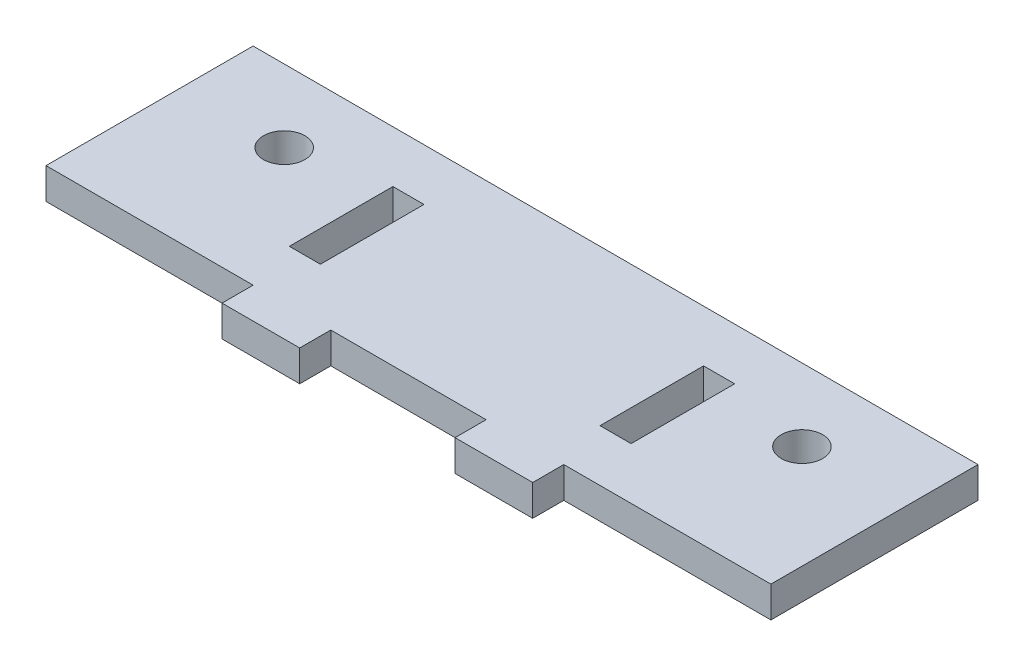
ISO-10303-21;
HEADER;
FILE_DESCRIPTION(('STEP AP214'),'2;1');
FILE_NAME('part.step','',(''),(''),'','','');
FILE_SCHEMA(('AUTOMOTIVE_DESIGN { 1 0 10303 214 1 1 1 1 }'));
ENDSEC;
DATA;
#1=APPLICATION_CONTEXT('core data for automotive mechanical design processes');
#2=APPLICATION_PROTOCOL_DEFINITION('international standard','automotive_design',2000,#1);
#3=PRODUCT_CONTEXT('',#1,'mechanical');
#4=PRODUCT('Part','Part','',(#3));
#5=PRODUCT_RELATED_PRODUCT_CATEGORY('part','',(#4));
#6=PRODUCT_DEFINITION_FORMATION('','',#4);
#7=PRODUCT_DEFINITION_CONTEXT('part definition',#1,'design');
#8=PRODUCT_DEFINITION('design','',#6,#7);
#9=PRODUCT_DEFINITION_SHAPE('','',#8);
#10=(LENGTH_UNIT() NAMED_UNIT(*) SI_UNIT(.MILLI.,.METRE.));
#11=(NAMED_UNIT(*) PLANE_ANGLE_UNIT() SI_UNIT($,.RADIAN.));
#12=(NAMED_UNIT(*) SI_UNIT($,.STERADIAN.) SOLID_ANGLE_UNIT());
#13=UNCERTAINTY_MEASURE_WITH_UNIT(LENGTH_MEASURE(1.E-05),#10,'distance_accuracy_value','');
#14=(GEOMETRIC_REPRESENTATION_CONTEXT(3) GLOBAL_UNCERTAINTY_ASSIGNED_CONTEXT((#13)) GLOBAL_UNIT_ASSIGNED_CONTEXT((#10,
#11,#12)) REPRESENTATION_CONTEXT('',''));
#15=CARTESIAN_POINT('',(0.,0.,0.));
#16=DIRECTION('',(0.,0.,1.));
#17=DIRECTION('',(1.,0.,0.));
#18=AXIS2_PLACEMENT_3D('',#15,#16,#17);
#19=CARTESIAN_POINT('',(0.,3.,0.));
#20=DIRECTION('',(0.,-1.,0.));
#21=DIRECTION('',(0.,0.,-1.));
#22=AXIS2_PLACEMENT_3D('',#19,#20,#21);
#23=PLANE('',#22);
#24=DIRECTION('',(0.,0.,1.));
#25=VECTOR('',#24,1.);
#26=CARTESIAN_POINT('',(18.5,3.,-15.));
#27=LINE('',#26,#25);
#28=CARTESIAN_POINT('',(18.5,3.,-15.));
#29=VERTEX_POINT('',#28);
#30=CARTESIAN_POINT('',(18.5,3.,-5.));
#31=VERTEX_POINT('',#30);
#32=EDGE_CURVE('E234',#29,#31,#27,.T.);
#33=ORIENTED_EDGE('',*,*,#32,.F.);
#34=DIRECTION('',(-1.,0.,0.));
#35=VECTOR('',#34,1.);
#36=CARTESIAN_POINT('',(18.5,3.,-15.));
#37=LINE('',#36,#35);
#38=CARTESIAN_POINT('',(21.5,3.,-15.));
#39=VERTEX_POINT('',#38);
#40=EDGE_CURVE('E245',#39,#29,#37,.T.);
#41=ORIENTED_EDGE('',*,*,#40,.F.);
#42=DIRECTION('',(0.,0.,-1.));
#43=VECTOR('',#42,1.);
#44=CARTESIAN_POINT('',(21.5,3.,-15.));
#45=LINE('',#44,#43);
#46=CARTESIAN_POINT('',(21.5,3.,-5.));
#47=VERTEX_POINT('',#46);
#48=EDGE_CURVE('E241',#47,#39,#45,.T.);
#49=ORIENTED_EDGE('',*,*,#48,.F.);
#50=DIRECTION('',(1.,0.,0.));
#51=VECTOR('',#50,1.);
#52=CARTESIAN_POINT('',(18.5,3.,-5.));
#53=LINE('',#52,#51);
#54=EDGE_CURVE('E237',#31,#47,#53,.T.);
#55=ORIENTED_EDGE('',*,*,#54,.F.);
#56=EDGE_LOOP('',(#33,#41,#49,#55));
#57=FACE_BOUND('',#56,.T.);
#58=DIRECTION('',(0.,0.,1.));
#59=VECTOR('',#58,1.);
#60=CARTESIAN_POINT('',(0.,3.,0.));
#61=LINE('',#60,#59);
#62=CARTESIAN_POINT('',(0.,3.,-20.));
#63=VERTEX_POINT('',#62);
#64=CARTESIAN_POINT('',(0.,3.,0.));
#65=VERTEX_POINT('',#64);
#66=EDGE_CURVE('E277',#63,#65,#61,.T.);
#67=ORIENTED_EDGE('',*,*,#66,.T.);
#68=DIRECTION('',(1.,0.,0.));
#69=VECTOR('',#68,1.);
#70=CARTESIAN_POINT('',(0.,3.,0.));
#71=LINE('',#70,#69);
#72=CARTESIAN_POINT('',(20.,3.,0.));
#73=VERTEX_POINT('',#72);
#74=EDGE_CURVE('E281',#65,#73,#71,.T.);
#75=ORIENTED_EDGE('',*,*,#74,.T.);
#76=DIRECTION('',(0.,0.,1.));
#77=VECTOR('',#76,1.);
#78=CARTESIAN_POINT('',(20.,3.,0.));
#79=LINE('',#78,#77);
#80=CARTESIAN_POINT('',(20.,3.,3.));
#81=VERTEX_POINT('',#80);
#82=EDGE_CURVE('E285',#73,#81,#79,.T.);
#83=ORIENTED_EDGE('',*,*,#82,.T.);
#84=DIRECTION('',(1.,0.,0.));
#85=VECTOR('',#84,1.);
#86=CARTESIAN_POINT('',(20.,3.,3.));
#87=LINE('',#86,#85);
#88=CARTESIAN_POINT('',(27.5,3.,3.));
#89=VERTEX_POINT('',#88);
#90=EDGE_CURVE('E288',#81,#89,#87,.T.);
#91=ORIENTED_EDGE('',*,*,#90,.T.);
#92=DIRECTION('',(0.,0.,-1.));
#93=VECTOR('',#92,1.);
#94=CARTESIAN_POINT('',(27.5,3.,0.));
#95=LINE('',#94,#93);
#96=CARTESIAN_POINT('',(27.5,3.,0.));
#97=VERTEX_POINT('',#96);
#98=EDGE_CURVE('E291',#89,#97,#95,.T.);
#99=ORIENTED_EDGE('',*,*,#98,.T.);
#100=DIRECTION('',(1.,0.,0.));
#101=VECTOR('',#100,1.);
#102=CARTESIAN_POINT('',(27.5,3.,0.));
#103=LINE('',#102,#101);
#104=CARTESIAN_POINT('',(42.5,3.,0.));
#105=VERTEX_POINT('',#104);
#106=EDGE_CURVE('E294',#97,#105,#103,.T.);
#107=ORIENTED_EDGE('',*,*,#106,.T.);
#108=DIRECTION('',(0.,0.,1.));
#109=VECTOR('',#108,1.);
#110=CARTESIAN_POINT('',(42.5,3.,0.));
#111=LINE('',#110,#109);
#112=CARTESIAN_POINT('',(42.5,3.,2.99999999999999));
#113=VERTEX_POINT('',#112);
#114=EDGE_CURVE('E297',#105,#113,#111,.T.);
#115=ORIENTED_EDGE('',*,*,#114,.T.);
#116=DIRECTION('',(1.,0.,0.));
#117=VECTOR('',#116,1.);
#118=CARTESIAN_POINT('',(50.,3.,2.99999999999998));
#119=LINE('',#118,#117);
#120=CARTESIAN_POINT('',(50.,3.,2.99999999999998));
#121=VERTEX_POINT('',#120);
#122=EDGE_CURVE('E300',#113,#121,#119,.T.);
#123=ORIENTED_EDGE('',*,*,#122,.T.);
#124=DIRECTION('',(0.,0.,-1.));
#125=VECTOR('',#124,1.);
#126=CARTESIAN_POINT('',(50.,3.,0.));
#127=LINE('',#126,#125);
#128=CARTESIAN_POINT('',(50.,3.,0.));
#129=VERTEX_POINT('',#128);
#130=EDGE_CURVE('E303',#121,#129,#127,.T.);
#131=ORIENTED_EDGE('',*,*,#130,.T.);
#132=DIRECTION('',(1.,0.,0.));
#133=VECTOR('',#132,1.);
#134=CARTESIAN_POINT('',(50.,3.,0.));
#135=LINE('',#134,#133);
#136=CARTESIAN_POINT('',(70.,3.,0.));
#137=VERTEX_POINT('',#136);
#138=EDGE_CURVE('E306',#129,#137,#135,.T.);
#139=ORIENTED_EDGE('',*,*,#138,.T.);
#140=DIRECTION('',(0.,0.,-1.));
#141=VECTOR('',#140,1.);
#142=CARTESIAN_POINT('',(70.,3.,0.));
#143=LINE('',#142,#141);
#144=CARTESIAN_POINT('',(70.,3.,-20.));
#145=VERTEX_POINT('',#144);
#146=EDGE_CURVE('E309',#137,#145,#143,.T.);
#147=ORIENTED_EDGE('',*,*,#146,.T.);
#148=DIRECTION('',(-1.,0.,0.));
#149=VECTOR('',#148,1.);
#150=CARTESIAN_POINT('',(0.,3.,-20.));
#151=LINE('',#150,#149);
#152=EDGE_CURVE('E312',#145,#63,#151,.T.);
#153=ORIENTED_EDGE('',*,*,#152,.T.);
#154=EDGE_LOOP('',(#67,#75,#83,#91,#99,#107,#115,#123,#131,#139,#147,#153));
#155=FACE_BOUND('',#154,.T.);
#156=DIRECTION('',(0.,0.,-1.));
#157=VECTOR('',#156,1.);
#158=CARTESIAN_POINT('',(51.5,3.,-15.));
#159=LINE('',#158,#157);
#160=CARTESIAN_POINT('',(51.5,3.,-5.00000000000002));
#161=VERTEX_POINT('',#160);
#162=CARTESIAN_POINT('',(51.5,3.,-15.));
#163=VERTEX_POINT('',#162);
#164=EDGE_CURVE('E183',#161,#163,#159,.T.);
#165=ORIENTED_EDGE('',*,*,#164,.F.);
#166=DIRECTION('',(1.,0.,0.));
#167=VECTOR('',#166,1.);
#168=CARTESIAN_POINT('',(51.5,3.,-5.00000000000002));
#169=LINE('',#168,#167);
#170=CARTESIAN_POINT('',(48.5,3.,-5.00000000000002));
#171=VERTEX_POINT('',#170);
#172=EDGE_CURVE('E210',#171,#161,#169,.T.);
#173=ORIENTED_EDGE('',*,*,#172,.F.);
#174=DIRECTION('',(0.,0.,1.));
#175=VECTOR('',#174,1.);
#176=CARTESIAN_POINT('',(48.5,3.,-15.));
#177=LINE('',#176,#175);
#178=CARTESIAN_POINT('',(48.5,3.,-15.));
#179=VERTEX_POINT('',#178);
#180=EDGE_CURVE('E206',#179,#171,#177,.T.);
#181=ORIENTED_EDGE('',*,*,#180,.F.);
#182=DIRECTION('',(-1.,0.,0.));
#183=VECTOR('',#182,1.);
#184=CARTESIAN_POINT('',(51.5,3.,-15.));
#185=LINE('',#184,#183);
#186=EDGE_CURVE('E192',#163,#179,#185,.T.);
#187=ORIENTED_EDGE('',*,*,#186,.F.);
#188=EDGE_LOOP('',(#165,#173,#181,#187));
#189=FACE_BOUND('',#188,.T.);
#190=CARTESIAN_POINT('',(10.,3.,-13.));
#191=DIRECTION('',(0.,1.,0.));
#192=DIRECTION('',(0.,0.,1.));
#193=AXIS2_PLACEMENT_3D('',#190,#191,#192);
#194=CIRCLE('',#193,2.);
#195=CARTESIAN_POINT('',(10.,3.,-11.));
#196=VERTEX_POINT('',#195);
#197=EDGE_CURVE('E218',#196,#196,#194,.T.);
#198=ORIENTED_EDGE('',*,*,#197,.F.);
#199=EDGE_LOOP('',(#198));
#200=FACE_BOUND('',#199,.T.);
#201=CARTESIAN_POINT('',(60.,3.,-13.));
#202=DIRECTION('',(0.,1.,0.));
#203=DIRECTION('',(0.,0.,-1.));
#204=AXIS2_PLACEMENT_3D('',#201,#202,#203);
#205=CIRCLE('',#204,2.);
#206=CARTESIAN_POINT('',(60.,3.,-15.));
#207=VERTEX_POINT('',#206);
#208=EDGE_CURVE('E759',#207,#207,#205,.T.);
#209=ORIENTED_EDGE('',*,*,#208,.F.);
#210=EDGE_LOOP('',(#209));
#211=FACE_BOUND('',#210,.T.);
#212=ADVANCED_FACE('F45',(#57,#155,#189,#200,#211),#23,.F.);
#213=CARTESIAN_POINT('',(0.,0.,0.));
#214=DIRECTION('',(0.,-1.,0.));
#215=DIRECTION('',(0.,0.,-1.));
#216=AXIS2_PLACEMENT_3D('',#213,#214,#215);
#217=PLANE('',#216);
#218=CARTESIAN_POINT('',(10.,0.,-13.));
#219=DIRECTION('',(0.,1.,0.));
#220=DIRECTION('',(0.,0.,1.));
#221=AXIS2_PLACEMENT_3D('',#218,#219,#220);
#222=CIRCLE('',#221,2.);
#223=CARTESIAN_POINT('',(10.,0.,-11.));
#224=VERTEX_POINT('',#223);
#225=EDGE_CURVE('E767',#224,#224,#222,.T.);
#226=ORIENTED_EDGE('',*,*,#225,.T.);
#227=EDGE_LOOP('',(#226));
#228=FACE_BOUND('',#227,.T.);
#229=DIRECTION('',(0.,0.,1.));
#230=VECTOR('',#229,1.);
#231=CARTESIAN_POINT('',(0.,0.,0.));
#232=LINE('',#231,#230);
#233=CARTESIAN_POINT('',(0.,0.,-20.));
#234=VERTEX_POINT('',#233);
#235=CARTESIAN_POINT('',(0.,0.,0.));
#236=VERTEX_POINT('',#235);
#237=EDGE_CURVE('E276',#234,#236,#232,.T.);
#238=ORIENTED_EDGE('',*,*,#237,.F.);
#239=DIRECTION('',(-1.,0.,0.));
#240=VECTOR('',#239,1.);
#241=CARTESIAN_POINT('',(0.,0.,-20.));
#242=LINE('',#241,#240);
#243=CARTESIAN_POINT('',(70.,0.,-20.));
#244=VERTEX_POINT('',#243);
#245=EDGE_CURVE('E282',#244,#234,#242,.T.);
#246=ORIENTED_EDGE('',*,*,#245,.F.);
#247=DIRECTION('',(0.,0.,-1.));
#248=VECTOR('',#247,1.);
#249=CARTESIAN_POINT('',(70.,0.,0.));
#250=LINE('',#249,#248);
#251=CARTESIAN_POINT('',(70.,0.,0.));
#252=VERTEX_POINT('',#251);
#253=EDGE_CURVE('E346',#252,#244,#250,.T.);
#254=ORIENTED_EDGE('',*,*,#253,.F.);
#255=DIRECTION('',(1.,0.,0.));
#256=VECTOR('',#255,1.);
#257=CARTESIAN_POINT('',(50.,0.,0.));
#258=LINE('',#257,#256);
#259=CARTESIAN_POINT('',(50.,0.,0.));
#260=VERTEX_POINT('',#259);
#261=EDGE_CURVE('E343',#260,#252,#258,.T.);
#262=ORIENTED_EDGE('',*,*,#261,.F.);
#263=DIRECTION('',(0.,0.,-1.));
#264=VECTOR('',#263,1.);
#265=CARTESIAN_POINT('',(50.,0.,0.));
#266=LINE('',#265,#264);
#267=CARTESIAN_POINT('',(50.,0.,2.99999999999998));
#268=VERTEX_POINT('',#267);
#269=EDGE_CURVE('E340',#268,#260,#266,.T.);
#270=ORIENTED_EDGE('',*,*,#269,.F.);
#271=DIRECTION('',(1.,0.,0.));
#272=VECTOR('',#271,1.);
#273=CARTESIAN_POINT('',(50.,0.,2.99999999999998));
#274=LINE('',#273,#272);
#275=CARTESIAN_POINT('',(42.5,0.,2.99999999999999));
#276=VERTEX_POINT('',#275);
#277=EDGE_CURVE('E337',#276,#268,#274,.T.);
#278=ORIENTED_EDGE('',*,*,#277,.F.);
#279=DIRECTION('',(0.,0.,1.));
#280=VECTOR('',#279,1.);
#281=CARTESIAN_POINT('',(42.5,0.,0.));
#282=LINE('',#281,#280);
#283=CARTESIAN_POINT('',(42.5,0.,0.));
#284=VERTEX_POINT('',#283);
#285=EDGE_CURVE('E334',#284,#276,#282,.T.);
#286=ORIENTED_EDGE('',*,*,#285,.F.);
#287=DIRECTION('',(1.,0.,0.));
#288=VECTOR('',#287,1.);
#289=CARTESIAN_POINT('',(27.5,0.,0.));
#290=LINE('',#289,#288);
#291=CARTESIAN_POINT('',(27.5,0.,0.));
#292=VERTEX_POINT('',#291);
#293=EDGE_CURVE('E331',#292,#284,#290,.T.);
#294=ORIENTED_EDGE('',*,*,#293,.F.);
#295=DIRECTION('',(0.,0.,-1.));
#296=VECTOR('',#295,1.);
#297=CARTESIAN_POINT('',(27.5,0.,0.));
#298=LINE('',#297,#296);
#299=CARTESIAN_POINT('',(27.5,0.,3.));
#300=VERTEX_POINT('',#299);
#301=EDGE_CURVE('E328',#300,#292,#298,.T.);
#302=ORIENTED_EDGE('',*,*,#301,.F.);
#303=DIRECTION('',(1.,0.,0.));
#304=VECTOR('',#303,1.);
#305=CARTESIAN_POINT('',(20.,0.,3.));
#306=LINE('',#305,#304);
#307=CARTESIAN_POINT('',(20.,0.,3.));
#308=VERTEX_POINT('',#307);
#309=EDGE_CURVE('E325',#308,#300,#306,.T.);
#310=ORIENTED_EDGE('',*,*,#309,.F.);
#311=DIRECTION('',(0.,0.,1.));
#312=VECTOR('',#311,1.);
#313=CARTESIAN_POINT('',(20.,0.,0.));
#314=LINE('',#313,#312);
#315=CARTESIAN_POINT('',(20.,0.,0.));
#316=VERTEX_POINT('',#315);
#317=EDGE_CURVE('E322',#316,#308,#314,.T.);
#318=ORIENTED_EDGE('',*,*,#317,.F.);
#319=DIRECTION('',(1.,0.,0.));
#320=VECTOR('',#319,1.);
#321=CARTESIAN_POINT('',(0.,0.,0.));
#322=LINE('',#321,#320);
#323=EDGE_CURVE('E319',#236,#316,#322,.T.);
#324=ORIENTED_EDGE('',*,*,#323,.F.);
#325=EDGE_LOOP('',(#238,#246,#254,#262,#270,#278,#286,#294,#302,#310,#318,#324));
#326=FACE_BOUND('',#325,.T.);
#327=DIRECTION('',(-1.,0.,0.));
#328=VECTOR('',#327,1.);
#329=CARTESIAN_POINT('',(18.5,0.,-15.));
#330=LINE('',#329,#328);
#331=CARTESIAN_POINT('',(21.5,0.,-15.));
#332=VERTEX_POINT('',#331);
#333=CARTESIAN_POINT('',(18.5,0.,-15.));
#334=VERTEX_POINT('',#333);
#335=EDGE_CURVE('E238',#332,#334,#330,.T.);
#336=ORIENTED_EDGE('',*,*,#335,.T.);
#337=DIRECTION('',(0.,0.,1.));
#338=VECTOR('',#337,1.);
#339=CARTESIAN_POINT('',(18.5,0.,-15.));
#340=LINE('',#339,#338);
#341=CARTESIAN_POINT('',(18.5,0.,-5.));
#342=VERTEX_POINT('',#341);
#343=EDGE_CURVE('E201',#334,#342,#340,.T.);
#344=ORIENTED_EDGE('',*,*,#343,.T.);
#345=DIRECTION('',(1.,0.,0.));
#346=VECTOR('',#345,1.);
#347=CARTESIAN_POINT('',(18.5,0.,-5.));
#348=LINE('',#347,#346);
#349=CARTESIAN_POINT('',(21.5,0.,-5.));
#350=VERTEX_POINT('',#349);
#351=EDGE_CURVE('E252',#342,#350,#348,.T.);
#352=ORIENTED_EDGE('',*,*,#351,.T.);
#353=DIRECTION('',(0.,0.,-1.));
#354=VECTOR('',#353,1.);
#355=CARTESIAN_POINT('',(21.5,0.,-15.));
#356=LINE('',#355,#354);
#357=EDGE_CURVE('E256',#350,#332,#356,.T.);
#358=ORIENTED_EDGE('',*,*,#357,.T.);
#359=EDGE_LOOP('',(#336,#344,#352,#358));
#360=FACE_BOUND('',#359,.T.);
#361=DIRECTION('',(1.,0.,0.));
#362=VECTOR('',#361,1.);
#363=CARTESIAN_POINT('',(51.5,0.,-5.00000000000002));
#364=LINE('',#363,#362);
#365=CARTESIAN_POINT('',(48.5,0.,-5.00000000000002));
#366=VERTEX_POINT('',#365);
#367=CARTESIAN_POINT('',(51.5,0.,-5.00000000000002));
#368=VERTEX_POINT('',#367);
#369=EDGE_CURVE('E193',#366,#368,#364,.T.);
#370=ORIENTED_EDGE('',*,*,#369,.T.);
#371=DIRECTION('',(0.,0.,-1.));
#372=VECTOR('',#371,1.);
#373=CARTESIAN_POINT('',(51.5,0.,-15.));
#374=LINE('',#373,#372);
#375=CARTESIAN_POINT('',(51.5,0.,-15.));
#376=VERTEX_POINT('',#375);
#377=EDGE_CURVE('E69',#368,#376,#374,.T.);
#378=ORIENTED_EDGE('',*,*,#377,.T.);
#379=DIRECTION('',(-1.,0.,0.));
#380=VECTOR('',#379,1.);
#381=CARTESIAN_POINT('',(51.5,0.,-15.));
#382=LINE('',#381,#380);
#383=CARTESIAN_POINT('',(48.5,0.,-15.));
#384=VERTEX_POINT('',#383);
#385=EDGE_CURVE('E199',#376,#384,#382,.T.);
#386=ORIENTED_EDGE('',*,*,#385,.T.);
#387=DIRECTION('',(0.,0.,1.));
#388=VECTOR('',#387,1.);
#389=CARTESIAN_POINT('',(48.5,0.,-15.));
#390=LINE('',#389,#388);
#391=EDGE_CURVE('E221',#384,#366,#390,.T.);
#392=ORIENTED_EDGE('',*,*,#391,.T.);
#393=EDGE_LOOP('',(#370,#378,#386,#392));
#394=FACE_BOUND('',#393,.T.);
#395=CARTESIAN_POINT('',(60.,0.,-13.));
#396=DIRECTION('',(0.,1.,0.));
#397=DIRECTION('',(0.,0.,-1.));
#398=AXIS2_PLACEMENT_3D('',#395,#396,#397);
#399=CIRCLE('',#398,2.);
#400=CARTESIAN_POINT('',(60.,0.,-15.));
#401=VERTEX_POINT('',#400);
#402=EDGE_CURVE('E762',#401,#401,#399,.T.);
#403=ORIENTED_EDGE('',*,*,#402,.T.);
#404=EDGE_LOOP('',(#403));
#405=FACE_BOUND('',#404,.T.);
#406=ADVANCED_FACE('F401',(#228,#326,#360,#394,#405),#217,.T.);
#407=CARTESIAN_POINT('',(0.,3.,0.));
#408=DIRECTION('',(1.,0.,0.));
#409=DIRECTION('',(0.,0.,-1.));
#410=AXIS2_PLACEMENT_3D('',#407,#408,#409);
#411=PLANE('',#410);
#412=ORIENTED_EDGE('',*,*,#237,.T.);
#413=DIRECTION('',(0.,-1.,0.));
#414=VECTOR('',#413,1.);
#415=CARTESIAN_POINT('',(0.,3.,0.));
#416=LINE('',#415,#414);
#417=EDGE_CURVE('E11',#65,#236,#416,.T.);
#418=ORIENTED_EDGE('',*,*,#417,.F.);
#419=ORIENTED_EDGE('',*,*,#66,.F.);
#420=DIRECTION('',(0.,-1.,0.));
#421=VECTOR('',#420,1.);
#422=CARTESIAN_POINT('',(0.,3.,-20.));
#423=LINE('',#422,#421);
#424=EDGE_CURVE('E315',#63,#234,#423,.T.);
#425=ORIENTED_EDGE('',*,*,#424,.T.);
#426=EDGE_LOOP('',(#412,#418,#419,#425));
#427=FACE_BOUND('',#426,.T.);
#428=ADVANCED_FACE('F47',(#427),#411,.F.);
#429=CARTESIAN_POINT('',(0.,3.,0.));
#430=DIRECTION('',(0.,0.,-1.));
#431=DIRECTION('',(-1.,0.,0.));
#432=AXIS2_PLACEMENT_3D('',#429,#430,#431);
#433=PLANE('',#432);
#434=ORIENTED_EDGE('',*,*,#323,.T.);
#435=DIRECTION('',(0.,-1.,0.));
#436=VECTOR('',#435,1.);
#437=CARTESIAN_POINT('',(20.,3.,0.));
#438=LINE('',#437,#436);
#439=EDGE_CURVE('E54',#73,#316,#438,.T.);
#440=ORIENTED_EDGE('',*,*,#439,.F.);
#441=ORIENTED_EDGE('',*,*,#74,.F.);
#442=ORIENTED_EDGE('',*,*,#417,.T.);
#443=EDGE_LOOP('',(#434,#440,#441,#442));
#444=FACE_BOUND('',#443,.T.);
#445=ADVANCED_FACE('F418',(#444),#433,.F.);
#446=CARTESIAN_POINT('',(20.,3.,0.));
#447=DIRECTION('',(1.,0.,0.));
#448=DIRECTION('',(0.,0.,-1.));
#449=AXIS2_PLACEMENT_3D('',#446,#447,#448);
#450=PLANE('',#449);
#451=ORIENTED_EDGE('',*,*,#317,.T.);
#452=DIRECTION('',(0.,-1.,0.));
#453=VECTOR('',#452,1.);
#454=CARTESIAN_POINT('',(20.,3.,3.));
#455=LINE('',#454,#453);
#456=EDGE_CURVE('E386',#81,#308,#455,.T.);
#457=ORIENTED_EDGE('',*,*,#456,.F.);
#458=ORIENTED_EDGE('',*,*,#82,.F.);
#459=ORIENTED_EDGE('',*,*,#439,.T.);
#460=EDGE_LOOP('',(#451,#457,#458,#459));
#461=FACE_BOUND('',#460,.T.);
#462=ADVANCED_FACE('F395',(#461),#450,.F.);
#463=CARTESIAN_POINT('',(20.,3.,3.));
#464=DIRECTION('',(0.,0.,-1.));
#465=DIRECTION('',(-1.,0.,0.));
#466=AXIS2_PLACEMENT_3D('',#463,#464,#465);
#467=PLANE('',#466);
#468=ORIENTED_EDGE('',*,*,#309,.T.);
#469=DIRECTION('',(0.,-1.,0.));
#470=VECTOR('',#469,1.);
#471=CARTESIAN_POINT('',(27.5,3.,3.));
#472=LINE('',#471,#470);
#473=EDGE_CURVE('E382',#89,#300,#472,.T.);
#474=ORIENTED_EDGE('',*,*,#473,.F.);
#475=ORIENTED_EDGE('',*,*,#90,.F.);
#476=ORIENTED_EDGE('',*,*,#456,.T.);
#477=EDGE_LOOP('',(#468,#474,#475,#476));
#478=FACE_BOUND('',#477,.T.);
#479=ADVANCED_FACE('F407',(#478),#467,.F.);
#480=CARTESIAN_POINT('',(27.5,3.,0.));
#481=DIRECTION('',(-1.,0.,0.));
#482=DIRECTION('',(0.,0.,1.));
#483=AXIS2_PLACEMENT_3D('',#480,#481,#482);
#484=PLANE('',#483);
#485=ORIENTED_EDGE('',*,*,#301,.T.);
#486=DIRECTION('',(0.,-1.,0.));
#487=VECTOR('',#486,1.);
#488=CARTESIAN_POINT('',(27.5,3.,0.));
#489=LINE('',#488,#487);
#490=EDGE_CURVE('E378',#97,#292,#489,.T.);
#491=ORIENTED_EDGE('',*,*,#490,.F.);
#492=ORIENTED_EDGE('',*,*,#98,.F.);
#493=ORIENTED_EDGE('',*,*,#473,.T.);
#494=EDGE_LOOP('',(#485,#491,#492,#493));
#495=FACE_BOUND('',#494,.T.);
#496=ADVANCED_FACE('F411',(#495),#484,.F.);
#497=CARTESIAN_POINT('',(27.5,3.,0.));
#498=DIRECTION('',(0.,0.,-1.));
#499=DIRECTION('',(-1.,0.,0.));
#500=AXIS2_PLACEMENT_3D('',#497,#498,#499);
#501=PLANE('',#500);
#502=ORIENTED_EDGE('',*,*,#293,.T.);
#503=DIRECTION('',(0.,-1.,0.));
#504=VECTOR('',#503,1.);
#505=CARTESIAN_POINT('',(42.5,3.,0.));
#506=LINE('',#505,#504);
#507=EDGE_CURVE('E374',#105,#284,#506,.T.);
#508=ORIENTED_EDGE('',*,*,#507,.F.);
#509=ORIENTED_EDGE('',*,*,#106,.F.);
#510=ORIENTED_EDGE('',*,*,#490,.T.);
#511=EDGE_LOOP('',(#502,#508,#509,#510));
#512=FACE_BOUND('',#511,.T.);
#513=ADVANCED_FACE('F451',(#512),#501,.F.);
#514=CARTESIAN_POINT('',(42.5,3.,0.));
#515=DIRECTION('',(1.,0.,0.));
#516=DIRECTION('',(0.,0.,-1.));
#517=AXIS2_PLACEMENT_3D('',#514,#515,#516);
#518=PLANE('',#517);
#519=ORIENTED_EDGE('',*,*,#285,.T.);
#520=DIRECTION('',(0.,-1.,0.));
#521=VECTOR('',#520,1.);
#522=CARTESIAN_POINT('',(42.5,3.,2.99999999999999));
#523=LINE('',#522,#521);
#524=EDGE_CURVE('E370',#113,#276,#523,.T.);
#525=ORIENTED_EDGE('',*,*,#524,.F.);
#526=ORIENTED_EDGE('',*,*,#114,.F.);
#527=ORIENTED_EDGE('',*,*,#507,.T.);
#528=EDGE_LOOP('',(#519,#525,#526,#527));
#529=FACE_BOUND('',#528,.T.);
#530=ADVANCED_FACE('F449',(#529),#518,.F.);
#531=CARTESIAN_POINT('',(50.,3.,2.99999999999998));
#532=DIRECTION('',(0.,0.,-1.));
#533=DIRECTION('',(-1.,0.,0.));
#534=AXIS2_PLACEMENT_3D('',#531,#532,#533);
#535=PLANE('',#534);
#536=ORIENTED_EDGE('',*,*,#277,.T.);
#537=DIRECTION('',(0.,-1.,0.));
#538=VECTOR('',#537,1.);
#539=CARTESIAN_POINT('',(50.,3.,2.99999999999998));
#540=LINE('',#539,#538);
#541=EDGE_CURVE('E366',#121,#268,#540,.T.);
#542=ORIENTED_EDGE('',*,*,#541,.F.);
#543=ORIENTED_EDGE('',*,*,#122,.F.);
#544=ORIENTED_EDGE('',*,*,#524,.T.);
#545=EDGE_LOOP('',(#536,#542,#543,#544));
#546=FACE_BOUND('',#545,.T.);
#547=ADVANCED_FACE('F445',(#546),#535,.F.);
#548=CARTESIAN_POINT('',(50.,3.,0.));
#549=DIRECTION('',(-1.,0.,0.));
#550=DIRECTION('',(0.,0.,1.));
#551=AXIS2_PLACEMENT_3D('',#548,#549,#550);
#552=PLANE('',#551);
#553=ORIENTED_EDGE('',*,*,#269,.T.);
#554=DIRECTION('',(0.,-1.,0.));
#555=VECTOR('',#554,1.);
#556=CARTESIAN_POINT('',(50.,3.,0.));
#557=LINE('',#556,#555);
#558=EDGE_CURVE('E362',#129,#260,#557,.T.);
#559=ORIENTED_EDGE('',*,*,#558,.F.);
#560=ORIENTED_EDGE('',*,*,#130,.F.);
#561=ORIENTED_EDGE('',*,*,#541,.T.);
#562=EDGE_LOOP('',(#553,#559,#560,#561));
#563=FACE_BOUND('',#562,.T.);
#564=ADVANCED_FACE('F440',(#563),#552,.F.);
#565=CARTESIAN_POINT('',(50.,3.,0.));
#566=DIRECTION('',(0.,0.,-1.));
#567=DIRECTION('',(-1.,0.,0.));
#568=AXIS2_PLACEMENT_3D('',#565,#566,#567);
#569=PLANE('',#568);
#570=ORIENTED_EDGE('',*,*,#261,.T.);
#571=DIRECTION('',(0.,-1.,0.));
#572=VECTOR('',#571,1.);
#573=CARTESIAN_POINT('',(70.,3.,0.));
#574=LINE('',#573,#572);
#575=EDGE_CURVE('E358',#137,#252,#574,.T.);
#576=ORIENTED_EDGE('',*,*,#575,.F.);
#577=ORIENTED_EDGE('',*,*,#138,.F.);
#578=ORIENTED_EDGE('',*,*,#558,.T.);
#579=EDGE_LOOP('',(#570,#576,#577,#578));
#580=FACE_BOUND('',#579,.T.);
#581=ADVANCED_FACE('F434',(#580),#569,.F.);
#582=CARTESIAN_POINT('',(70.,3.,0.));
#583=DIRECTION('',(-1.,0.,0.));
#584=DIRECTION('',(0.,0.,1.));
#585=AXIS2_PLACEMENT_3D('',#582,#583,#584);
#586=PLANE('',#585);
#587=ORIENTED_EDGE('',*,*,#253,.T.);
#588=DIRECTION('',(0.,-1.,0.));
#589=VECTOR('',#588,1.);
#590=CARTESIAN_POINT('',(70.,3.,-20.));
#591=LINE('',#590,#589);
#592=EDGE_CURVE('E354',#145,#244,#591,.T.);
#593=ORIENTED_EDGE('',*,*,#592,.F.);
#594=ORIENTED_EDGE('',*,*,#146,.F.);
#595=ORIENTED_EDGE('',*,*,#575,.T.);
#596=EDGE_LOOP('',(#587,#593,#594,#595));
#597=FACE_BOUND('',#596,.T.);
#598=ADVANCED_FACE('F430',(#597),#586,.F.);
#599=CARTESIAN_POINT('',(0.,3.,-20.));
#600=DIRECTION('',(0.,0.,1.));
#601=DIRECTION('',(1.,0.,0.));
#602=AXIS2_PLACEMENT_3D('',#599,#600,#601);
#603=PLANE('',#602);
#604=ORIENTED_EDGE('',*,*,#245,.T.);
#605=ORIENTED_EDGE('',*,*,#424,.F.);
#606=ORIENTED_EDGE('',*,*,#152,.F.);
#607=ORIENTED_EDGE('',*,*,#592,.T.);
#608=EDGE_LOOP('',(#604,#605,#606,#607));
#609=FACE_BOUND('',#608,.T.);
#610=ADVANCED_FACE('F425',(#609),#603,.F.);
#611=CARTESIAN_POINT('',(18.5,3.,-15.));
#612=DIRECTION('',(1.,0.,0.));
#613=DIRECTION('',(0.,0.,-1.));
#614=AXIS2_PLACEMENT_3D('',#611,#612,#613);
#615=PLANE('',#614);
#616=ORIENTED_EDGE('',*,*,#343,.F.);
#617=DIRECTION('',(0.,-1.,0.));
#618=VECTOR('',#617,1.);
#619=CARTESIAN_POINT('',(18.5,3.,-15.));
#620=LINE('',#619,#618);
#621=EDGE_CURVE('E248',#29,#334,#620,.T.);
#622=ORIENTED_EDGE('',*,*,#621,.F.);
#623=ORIENTED_EDGE('',*,*,#32,.T.);
#624=DIRECTION('',(0.,-1.,0.));
#625=VECTOR('',#624,1.);
#626=CARTESIAN_POINT('',(18.5,3.,-5.));
#627=LINE('',#626,#625);
#628=EDGE_CURVE('E272',#31,#342,#627,.T.);
#629=ORIENTED_EDGE('',*,*,#628,.T.);
#630=EDGE_LOOP('',(#616,#622,#623,#629));
#631=FACE_BOUND('',#630,.T.);
#632=ADVANCED_FACE('F470',(#631),#615,.T.);
#633=CARTESIAN_POINT('',(18.5,3.,-5.));
#634=DIRECTION('',(0.,0.,-1.));
#635=DIRECTION('',(-1.,0.,0.));
#636=AXIS2_PLACEMENT_3D('',#633,#634,#635);
#637=PLANE('',#636);
#638=ORIENTED_EDGE('',*,*,#351,.F.);
#639=ORIENTED_EDGE('',*,*,#628,.F.);
#640=ORIENTED_EDGE('',*,*,#54,.T.);
#641=DIRECTION('',(0.,-1.,0.));
#642=VECTOR('',#641,1.);
#643=CARTESIAN_POINT('',(21.5,3.,-5.));
#644=LINE('',#643,#642);
#645=EDGE_CURVE('E269',#47,#350,#644,.T.);
#646=ORIENTED_EDGE('',*,*,#645,.T.);
#647=EDGE_LOOP('',(#638,#639,#640,#646));
#648=FACE_BOUND('',#647,.T.);
#649=ADVANCED_FACE('F508',(#648),#637,.T.);
#650=CARTESIAN_POINT('',(21.5,3.,-15.));
#651=DIRECTION('',(-1.,0.,0.));
#652=DIRECTION('',(0.,0.,1.));
#653=AXIS2_PLACEMENT_3D('',#650,#651,#652);
#654=PLANE('',#653);
#655=ORIENTED_EDGE('',*,*,#357,.F.);
#656=ORIENTED_EDGE('',*,*,#645,.F.);
#657=ORIENTED_EDGE('',*,*,#48,.T.);
#658=DIRECTION('',(0.,-1.,0.));
#659=VECTOR('',#658,1.);
#660=CARTESIAN_POINT('',(21.5,3.,-15.));
#661=LINE('',#660,#659);
#662=EDGE_CURVE('E266',#39,#332,#661,.T.);
#663=ORIENTED_EDGE('',*,*,#662,.T.);
#664=EDGE_LOOP('',(#655,#656,#657,#663));
#665=FACE_BOUND('',#664,.T.);
#666=ADVANCED_FACE('F515',(#665),#654,.T.);
#667=CARTESIAN_POINT('',(18.5,3.,-15.));
#668=DIRECTION('',(0.,0.,1.));
#669=DIRECTION('',(1.,0.,0.));
#670=AXIS2_PLACEMENT_3D('',#667,#668,#669);
#671=PLANE('',#670);
#672=ORIENTED_EDGE('',*,*,#335,.F.);
#673=ORIENTED_EDGE('',*,*,#662,.F.);
#674=ORIENTED_EDGE('',*,*,#40,.T.);
#675=ORIENTED_EDGE('',*,*,#621,.T.);
#676=EDGE_LOOP('',(#672,#673,#674,#675));
#677=FACE_BOUND('',#676,.T.);
#678=ADVANCED_FACE('F522',(#677),#671,.T.);
#679=CARTESIAN_POINT('',(51.5,3.,-15.));
#680=DIRECTION('',(-1.,0.,0.));
#681=DIRECTION('',(0.,0.,1.));
#682=AXIS2_PLACEMENT_3D('',#679,#680,#681);
#683=PLANE('',#682);
#684=ORIENTED_EDGE('',*,*,#377,.F.);
#685=DIRECTION('',(0.,-1.,0.));
#686=VECTOR('',#685,1.);
#687=CARTESIAN_POINT('',(51.5,3.,-5.00000000000002));
#688=LINE('',#687,#686);
#689=EDGE_CURVE('E187',#161,#368,#688,.T.);
#690=ORIENTED_EDGE('',*,*,#689,.F.);
#691=ORIENTED_EDGE('',*,*,#164,.T.);
#692=DIRECTION('',(0.,-1.,0.));
#693=VECTOR('',#692,1.);
#694=CARTESIAN_POINT('',(51.5,3.,-15.));
#695=LINE('',#694,#693);
#696=EDGE_CURVE('E186',#163,#376,#695,.T.);
#697=ORIENTED_EDGE('',*,*,#696,.T.);
#698=EDGE_LOOP('',(#684,#690,#691,#697));
#699=FACE_BOUND('',#698,.T.);
#700=ADVANCED_FACE('F185',(#699),#683,.T.);
#701=CARTESIAN_POINT('',(51.5,3.,-15.));
#702=DIRECTION('',(0.,0.,1.));
#703=DIRECTION('',(1.,0.,0.));
#704=AXIS2_PLACEMENT_3D('',#701,#702,#703);
#705=PLANE('',#704);
#706=ORIENTED_EDGE('',*,*,#385,.F.);
#707=ORIENTED_EDGE('',*,*,#696,.F.);
#708=ORIENTED_EDGE('',*,*,#186,.T.);
#709=DIRECTION('',(0.,-1.,0.));
#710=VECTOR('',#709,1.);
#711=CARTESIAN_POINT('',(48.5,3.,-15.));
#712=LINE('',#711,#710);
#713=EDGE_CURVE('E202',#179,#384,#712,.T.);
#714=ORIENTED_EDGE('',*,*,#713,.T.);
#715=EDGE_LOOP('',(#706,#707,#708,#714));
#716=FACE_BOUND('',#715,.T.);
#717=ADVANCED_FACE('F196',(#716),#705,.T.);
#718=CARTESIAN_POINT('',(48.5,3.,-15.));
#719=DIRECTION('',(1.,0.,0.));
#720=DIRECTION('',(0.,0.,-1.));
#721=AXIS2_PLACEMENT_3D('',#718,#719,#720);
#722=PLANE('',#721);
#723=ORIENTED_EDGE('',*,*,#391,.F.);
#724=ORIENTED_EDGE('',*,*,#713,.F.);
#725=ORIENTED_EDGE('',*,*,#180,.T.);
#726=DIRECTION('',(0.,-1.,0.));
#727=VECTOR('',#726,1.);
#728=CARTESIAN_POINT('',(48.5,3.,-5.00000000000002));
#729=LINE('',#728,#727);
#730=EDGE_CURVE('E61',#171,#366,#729,.T.);
#731=ORIENTED_EDGE('',*,*,#730,.T.);
#732=EDGE_LOOP('',(#723,#724,#725,#731));
#733=FACE_BOUND('',#732,.T.);
#734=ADVANCED_FACE('F543',(#733),#722,.T.);
#735=CARTESIAN_POINT('',(51.5,3.,-5.00000000000002));
#736=DIRECTION('',(0.,0.,-1.));
#737=DIRECTION('',(-1.,0.,0.));
#738=AXIS2_PLACEMENT_3D('',#735,#736,#737);
#739=PLANE('',#738);
#740=ORIENTED_EDGE('',*,*,#369,.F.);
#741=ORIENTED_EDGE('',*,*,#730,.F.);
#742=ORIENTED_EDGE('',*,*,#172,.T.);
#743=ORIENTED_EDGE('',*,*,#689,.T.);
#744=EDGE_LOOP('',(#740,#741,#742,#743));
#745=FACE_BOUND('',#744,.T.);
#746=ADVANCED_FACE('F550',(#745),#739,.T.);
#747=CARTESIAN_POINT('',(10.,3.,-13.));
#748=DIRECTION('',(0.,-1.,0.));
#749=DIRECTION('',(0.,0.,-1.));
#750=AXIS2_PLACEMENT_3D('',#747,#748,#749);
#751=CYLINDRICAL_SURFACE('',#750,2.);
#752=ORIENTED_EDGE('',*,*,#197,.T.);
#753=EDGE_LOOP('',(#752));
#754=FACE_BOUND('',#753,.T.);
#755=ORIENTED_EDGE('',*,*,#225,.F.);
#756=EDGE_LOOP('',(#755));
#757=FACE_BOUND('',#756,.T.);
#758=ADVANCED_FACE('F558',(#754,#757),#751,.F.);
#759=CARTESIAN_POINT('',(60.,3.,-13.));
#760=DIRECTION('',(0.,-1.,0.));
#761=DIRECTION('',(0.,0.,-1.));
#762=AXIS2_PLACEMENT_3D('',#759,#760,#761);
#763=CYLINDRICAL_SURFACE('',#762,2.);
#764=ORIENTED_EDGE('',*,*,#208,.T.);
#765=EDGE_LOOP('',(#764));
#766=FACE_BOUND('',#765,.T.);
#767=ORIENTED_EDGE('',*,*,#402,.F.);
#768=EDGE_LOOP('',(#767));
#769=FACE_BOUND('',#768,.T.);
#770=ADVANCED_FACE('F565',(#766,#769),#763,.F.);
#771=CLOSED_SHELL('',(#212,#406,#428,#445,#462,#479,#496,#513,#530,#547,#564,#581,#598,#610,
#632,#649,#666,#678,#700,#717,#734,#746,#758,#770));
#772=MANIFOLD_SOLID_BREP('B2',#771);
#773=ADVANCED_BREP_SHAPE_REPRESENTATION('',(#18,#772),#14);
#774=SHAPE_DEFINITION_REPRESENTATION(#9,#773);
ENDSEC;
END-ISO-10303-21;
